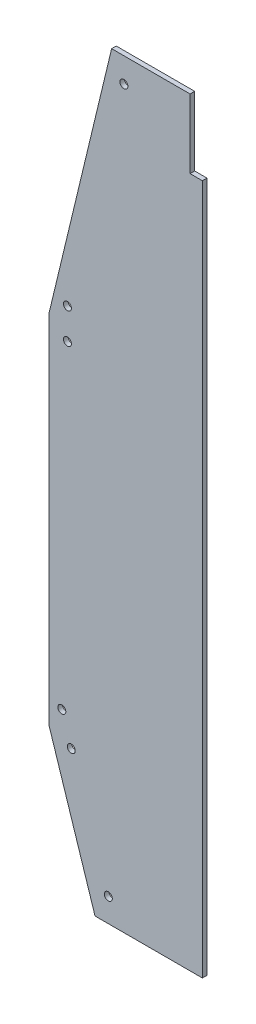
ISO-10303-21;
HEADER;
FILE_DESCRIPTION(('STEP AP214'),'2;1');
FILE_NAME('part.step','',(''),(''),'','','');
FILE_SCHEMA(('AUTOMOTIVE_DESIGN { 1 0 10303 214 1 1 1 1 }'));
ENDSEC;
DATA;
#1=APPLICATION_CONTEXT('core data for automotive mechanical design processes');
#2=APPLICATION_PROTOCOL_DEFINITION('international standard','automotive_design',2000,#1);
#3=PRODUCT_CONTEXT('',#1,'mechanical');
#4=PRODUCT('Part','Part','',(#3));
#5=PRODUCT_RELATED_PRODUCT_CATEGORY('part','',(#4));
#6=PRODUCT_DEFINITION_FORMATION('','',#4);
#7=PRODUCT_DEFINITION_CONTEXT('part definition',#1,'design');
#8=PRODUCT_DEFINITION('design','',#6,#7);
#9=PRODUCT_DEFINITION_SHAPE('','',#8);
#10=(LENGTH_UNIT() NAMED_UNIT(*) SI_UNIT(.MILLI.,.METRE.));
#11=(NAMED_UNIT(*) PLANE_ANGLE_UNIT() SI_UNIT($,.RADIAN.));
#12=(NAMED_UNIT(*) SI_UNIT($,.STERADIAN.) SOLID_ANGLE_UNIT());
#13=UNCERTAINTY_MEASURE_WITH_UNIT(LENGTH_MEASURE(1.E-05),#10,'distance_accuracy_value','');
#14=(GEOMETRIC_REPRESENTATION_CONTEXT(3) GLOBAL_UNCERTAINTY_ASSIGNED_CONTEXT((#13)) GLOBAL_UNIT_ASSIGNED_CONTEXT((#10,
#11,#12)) REPRESENTATION_CONTEXT('',''));
#15=CARTESIAN_POINT('',(0.,0.,0.));
#16=DIRECTION('',(0.,0.,1.));
#17=DIRECTION('',(1.,0.,0.));
#18=AXIS2_PLACEMENT_3D('',#15,#16,#17);
#19=CARTESIAN_POINT('',(0.,0.,3.));
#20=DIRECTION('',(-1.,0.,0.));
#21=DIRECTION('',(0.,-1.,0.));
#22=AXIS2_PLACEMENT_3D('',#19,#20,#21);
#23=PLANE('',#22);
#24=DIRECTION('',(0.,1.,0.));
#25=VECTOR('',#24,1.);
#26=CARTESIAN_POINT('',(0.,0.,0.));
#27=LINE('',#26,#25);
#28=CARTESIAN_POINT('',(0.,0.,0.));
#29=VERTEX_POINT('',#28);
#30=CARTESIAN_POINT('',(0.,450.3,0.));
#31=VERTEX_POINT('',#30);
#32=EDGE_CURVE('E133',#29,#31,#27,.T.);
#33=ORIENTED_EDGE('',*,*,#32,.T.);
#34=DIRECTION('',(0.,0.,-1.));
#35=VECTOR('',#34,1.);
#36=CARTESIAN_POINT('',(0.,450.3,3.));
#37=LINE('',#36,#35);
#38=CARTESIAN_POINT('',(0.,450.3,3.));
#39=VERTEX_POINT('',#38);
#40=EDGE_CURVE('E11',#39,#31,#37,.T.);
#41=ORIENTED_EDGE('',*,*,#40,.F.);
#42=DIRECTION('',(0.,1.,0.));
#43=VECTOR('',#42,1.);
#44=CARTESIAN_POINT('',(0.,0.,3.));
#45=LINE('',#44,#43);
#46=CARTESIAN_POINT('',(0.,0.,3.));
#47=VERTEX_POINT('',#46);
#48=EDGE_CURVE('E148',#47,#39,#45,.T.);
#49=ORIENTED_EDGE('',*,*,#48,.F.);
#50=DIRECTION('',(0.,0.,-1.));
#51=VECTOR('',#50,1.);
#52=CARTESIAN_POINT('',(0.,0.,3.));
#53=LINE('',#52,#51);
#54=EDGE_CURVE('E129',#47,#29,#53,.T.);
#55=ORIENTED_EDGE('',*,*,#54,.T.);
#56=EDGE_LOOP('',(#33,#41,#49,#55));
#57=FACE_BOUND('',#56,.T.);
#58=ADVANCED_FACE('F37',(#57),#23,.F.);
#59=CARTESIAN_POINT('',(0.,450.3,3.));
#60=DIRECTION('',(0.,-1.,0.));
#61=DIRECTION('',(1.,0.,0.));
#62=AXIS2_PLACEMENT_3D('',#59,#60,#61);
#63=PLANE('',#62);
#64=DIRECTION('',(-1.,0.,0.));
#65=VECTOR('',#64,1.);
#66=CARTESIAN_POINT('',(0.,450.3,0.));
#67=LINE('',#66,#65);
#68=CARTESIAN_POINT('',(-8.,450.3,0.));
#69=VERTEX_POINT('',#68);
#70=EDGE_CURVE('E136',#31,#69,#67,.T.);
#71=ORIENTED_EDGE('',*,*,#70,.T.);
#72=DIRECTION('',(0.,0.,-1.));
#73=VECTOR('',#72,1.);
#74=CARTESIAN_POINT('',(-8.,450.3,3.));
#75=LINE('',#74,#73);
#76=CARTESIAN_POINT('',(-8.,450.3,3.));
#77=VERTEX_POINT('',#76);
#78=EDGE_CURVE('E45',#77,#69,#75,.T.);
#79=ORIENTED_EDGE('',*,*,#78,.F.);
#80=DIRECTION('',(-1.,0.,0.));
#81=VECTOR('',#80,1.);
#82=CARTESIAN_POINT('',(0.,450.3,3.));
#83=LINE('',#82,#81);
#84=EDGE_CURVE('E96',#39,#77,#83,.T.);
#85=ORIENTED_EDGE('',*,*,#84,.F.);
#86=ORIENTED_EDGE('',*,*,#40,.T.);
#87=EDGE_LOOP('',(#71,#79,#85,#86));
#88=FACE_BOUND('',#87,.T.);
#89=ADVANCED_FACE('F245',(#88),#63,.F.);
#90=CARTESIAN_POINT('',(-8.,450.3,3.));
#91=DIRECTION('',(-1.,0.,0.));
#92=DIRECTION('',(0.,0.,1.));
#93=AXIS2_PLACEMENT_3D('',#90,#91,#92);
#94=PLANE('',#93);
#95=DIRECTION('',(0.,1.,0.));
#96=VECTOR('',#95,1.);
#97=CARTESIAN_POINT('',(-8.,450.3,0.));
#98=LINE('',#97,#96);
#99=CARTESIAN_POINT('',(-8.,495.3,0.));
#100=VERTEX_POINT('',#99);
#101=EDGE_CURVE('E139',#69,#100,#98,.T.);
#102=ORIENTED_EDGE('',*,*,#101,.T.);
#103=DIRECTION('',(0.,0.,-1.));
#104=VECTOR('',#103,1.);
#105=CARTESIAN_POINT('',(-8.,495.3,3.));
#106=LINE('',#105,#104);
#107=CARTESIAN_POINT('',(-8.,495.3,3.));
#108=VERTEX_POINT('',#107);
#109=EDGE_CURVE('E155',#108,#100,#106,.T.);
#110=ORIENTED_EDGE('',*,*,#109,.F.);
#111=DIRECTION('',(0.,1.,0.));
#112=VECTOR('',#111,1.);
#113=CARTESIAN_POINT('',(-8.,450.3,3.));
#114=LINE('',#113,#112);
#115=EDGE_CURVE('E163',#77,#108,#114,.T.);
#116=ORIENTED_EDGE('',*,*,#115,.F.);
#117=ORIENTED_EDGE('',*,*,#78,.T.);
#118=EDGE_LOOP('',(#102,#110,#116,#117));
#119=FACE_BOUND('',#118,.T.);
#120=ADVANCED_FACE('F161',(#119),#94,.F.);
#121=CARTESIAN_POINT('',(-8.,495.3,3.));
#122=DIRECTION('',(0.,-1.,0.));
#123=DIRECTION('',(0.,0.,-1.));
#124=AXIS2_PLACEMENT_3D('',#121,#122,#123);
#125=PLANE('',#124);
#126=DIRECTION('',(-1.,0.,0.));
#127=VECTOR('',#126,1.);
#128=CARTESIAN_POINT('',(-8.,495.3,0.));
#129=LINE('',#128,#127);
#130=CARTESIAN_POINT('',(-59.18,495.3,0.));
#131=VERTEX_POINT('',#130);
#132=EDGE_CURVE('E141',#100,#131,#129,.T.);
#133=ORIENTED_EDGE('',*,*,#132,.T.);
#134=DIRECTION('',(0.,0.,-1.));
#135=VECTOR('',#134,1.);
#136=CARTESIAN_POINT('',(-59.18,495.3,3.));
#137=LINE('',#136,#135);
#138=CARTESIAN_POINT('',(-59.18,495.3,3.));
#139=VERTEX_POINT('',#138);
#140=EDGE_CURVE('E152',#139,#131,#137,.T.);
#141=ORIENTED_EDGE('',*,*,#140,.F.);
#142=DIRECTION('',(-1.,0.,0.));
#143=VECTOR('',#142,1.);
#144=CARTESIAN_POINT('',(-8.,495.3,3.));
#145=LINE('',#144,#143);
#146=EDGE_CURVE('E175',#108,#139,#145,.T.);
#147=ORIENTED_EDGE('',*,*,#146,.F.);
#148=ORIENTED_EDGE('',*,*,#109,.T.);
#149=EDGE_LOOP('',(#133,#141,#147,#148));
#150=FACE_BOUND('',#149,.T.);
#151=ADVANCED_FACE('F171',(#150),#125,.F.);
#152=CARTESIAN_POINT('',(-59.18,495.3,3.));
#153=DIRECTION('',(0.972298871243199,-0.233741106738206,0.));
#154=DIRECTION('',(0.233741106738206,0.972298871243199,0.));
#155=AXIS2_PLACEMENT_3D('',#152,#153,#154);
#156=PLANE('',#155);
#157=DIRECTION('',(-0.233741106738206,-0.972298871243199,0.));
#158=VECTOR('',#157,1.);
#159=CARTESIAN_POINT('',(-59.18,495.3,0.));
#160=LINE('',#159,#158);
#161=CARTESIAN_POINT('',(-100.,325.5,0.));
#162=VERTEX_POINT('',#161);
#163=EDGE_CURVE('E143',#131,#162,#160,.T.);
#164=ORIENTED_EDGE('',*,*,#163,.T.);
#165=DIRECTION('',(0.,0.,-1.));
#166=VECTOR('',#165,1.);
#167=CARTESIAN_POINT('',(-100.,325.5,3.));
#168=LINE('',#167,#166);
#169=CARTESIAN_POINT('',(-100.,325.5,3.));
#170=VERTEX_POINT('',#169);
#171=EDGE_CURVE('E124',#170,#162,#168,.T.);
#172=ORIENTED_EDGE('',*,*,#171,.F.);
#173=DIRECTION('',(-0.233741106738206,-0.972298871243199,0.));
#174=VECTOR('',#173,1.);
#175=CARTESIAN_POINT('',(-59.18,495.3,3.));
#176=LINE('',#175,#174);
#177=EDGE_CURVE('E115',#139,#170,#176,.T.);
#178=ORIENTED_EDGE('',*,*,#177,.F.);
#179=ORIENTED_EDGE('',*,*,#140,.T.);
#180=EDGE_LOOP('',(#164,#172,#178,#179));
#181=FACE_BOUND('',#180,.T.);
#182=ADVANCED_FACE('F174',(#181),#156,.F.);
#183=CARTESIAN_POINT('',(-100.,92.65,3.));
#184=DIRECTION('',(1.,0.,0.));
#185=DIRECTION('',(0.,0.,-1.));
#186=AXIS2_PLACEMENT_3D('',#183,#184,#185);
#187=PLANE('',#186);
#188=DIRECTION('',(0.,-1.,0.));
#189=VECTOR('',#188,1.);
#190=CARTESIAN_POINT('',(-100.,92.65,0.));
#191=LINE('',#190,#189);
#192=CARTESIAN_POINT('',(-100.,92.65,0.));
#193=VERTEX_POINT('',#192);
#194=EDGE_CURVE('E123',#162,#193,#191,.T.);
#195=ORIENTED_EDGE('',*,*,#194,.T.);
#196=DIRECTION('',(0.,0.,-1.));
#197=VECTOR('',#196,1.);
#198=CARTESIAN_POINT('',(-100.,92.65,3.));
#199=LINE('',#198,#197);
#200=CARTESIAN_POINT('',(-100.,92.65,3.));
#201=VERTEX_POINT('',#200);
#202=EDGE_CURVE('E120',#201,#193,#199,.T.);
#203=ORIENTED_EDGE('',*,*,#202,.F.);
#204=DIRECTION('',(0.,-1.,0.));
#205=VECTOR('',#204,1.);
#206=CARTESIAN_POINT('',(-100.,92.65,3.));
#207=LINE('',#206,#205);
#208=EDGE_CURVE('E109',#170,#201,#207,.T.);
#209=ORIENTED_EDGE('',*,*,#208,.F.);
#210=ORIENTED_EDGE('',*,*,#171,.T.);
#211=EDGE_LOOP('',(#195,#203,#209,#210));
#212=FACE_BOUND('',#211,.T.);
#213=ADVANCED_FACE('F121',(#212),#187,.F.);
#214=CARTESIAN_POINT('',(-70.,0.,3.));
#215=DIRECTION('',(0.951369306348151,0.308052662605985,0.));
#216=DIRECTION('',(-0.308052662605985,0.951369306348152,0.));
#217=AXIS2_PLACEMENT_3D('',#214,#215,#216);
#218=PLANE('',#217);
#219=DIRECTION('',(0.308052662605985,-0.951369306348152,0.));
#220=VECTOR('',#219,1.);
#221=CARTESIAN_POINT('',(-70.,0.,0.));
#222=LINE('',#221,#220);
#223=CARTESIAN_POINT('',(-70.,0.,0.));
#224=VERTEX_POINT('',#223);
#225=EDGE_CURVE('E82',#193,#224,#222,.T.);
#226=ORIENTED_EDGE('',*,*,#225,.T.);
#227=DIRECTION('',(0.,0.,-1.));
#228=VECTOR('',#227,1.);
#229=CARTESIAN_POINT('',(-70.,0.,3.));
#230=LINE('',#229,#228);
#231=CARTESIAN_POINT('',(-70.,0.,3.));
#232=VERTEX_POINT('',#231);
#233=EDGE_CURVE('E125',#232,#224,#230,.T.);
#234=ORIENTED_EDGE('',*,*,#233,.F.);
#235=DIRECTION('',(0.308052662605985,-0.951369306348152,0.));
#236=VECTOR('',#235,1.);
#237=CARTESIAN_POINT('',(-70.,0.,3.));
#238=LINE('',#237,#236);
#239=EDGE_CURVE('E113',#201,#232,#238,.T.);
#240=ORIENTED_EDGE('',*,*,#239,.F.);
#241=ORIENTED_EDGE('',*,*,#202,.T.);
#242=EDGE_LOOP('',(#226,#234,#240,#241));
#243=FACE_BOUND('',#242,.T.);
#244=ADVANCED_FACE('F127',(#243),#218,.F.);
#245=CARTESIAN_POINT('',(0.,0.,3.));
#246=DIRECTION('',(0.,1.,0.));
#247=DIRECTION('',(-1.,0.,0.));
#248=AXIS2_PLACEMENT_3D('',#245,#246,#247);
#249=PLANE('',#248);
#250=DIRECTION('',(1.,0.,0.));
#251=VECTOR('',#250,1.);
#252=CARTESIAN_POINT('',(0.,0.,0.));
#253=LINE('',#252,#251);
#254=EDGE_CURVE('E88',#224,#29,#253,.T.);
#255=ORIENTED_EDGE('',*,*,#254,.T.);
#256=ORIENTED_EDGE('',*,*,#54,.F.);
#257=DIRECTION('',(1.,0.,0.));
#258=VECTOR('',#257,1.);
#259=CARTESIAN_POINT('',(0.,0.,3.));
#260=LINE('',#259,#258);
#261=EDGE_CURVE('E53',#232,#47,#260,.T.);
#262=ORIENTED_EDGE('',*,*,#261,.F.);
#263=ORIENTED_EDGE('',*,*,#233,.T.);
#264=EDGE_LOOP('',(#255,#256,#262,#263));
#265=FACE_BOUND('',#264,.T.);
#266=ADVANCED_FACE('F252',(#265),#249,.F.);
#267=CARTESIAN_POINT('',(0.,0.,3.));
#268=DIRECTION('',(0.,0.,1.));
#269=DIRECTION('',(1.,0.,0.));
#270=AXIS2_PLACEMENT_3D('',#267,#268,#269);
#271=PLANE('',#270);
#272=CARTESIAN_POINT('',(-61.3351873852428,15.4407470230038,3.));
#273=DIRECTION('',(0.,0.,1.));
#274=DIRECTION('',(1.,0.,0.));
#275=AXIS2_PLACEMENT_3D('',#272,#273,#274);
#276=CIRCLE('',#275,2.6);
#277=CARTESIAN_POINT('',(-58.7351873852428,15.4407470230038,3.));
#278=VERTEX_POINT('',#277);
#279=EDGE_CURVE('E137',#278,#278,#276,.T.);
#280=ORIENTED_EDGE('',*,*,#279,.F.);
#281=EDGE_LOOP('',(#280));
#282=FACE_BOUND('',#281,.T.);
#283=CARTESIAN_POINT('',(-85.5030416977623,86.8329388877904,3.));
#284=DIRECTION('',(0.,0.,1.));
#285=DIRECTION('',(1.,0.,0.));
#286=AXIS2_PLACEMENT_3D('',#283,#284,#285);
#287=CIRCLE('',#286,2.59999999999999);
#288=CARTESIAN_POINT('',(-82.9030416977623,86.8329388877904,3.));
#289=VERTEX_POINT('',#288);
#290=EDGE_CURVE('E183',#289,#289,#287,.T.);
#291=ORIENTED_EDGE('',*,*,#290,.F.);
#292=EDGE_LOOP('',(#291));
#293=FACE_BOUND('',#292,.T.);
#294=CARTESIAN_POINT('',(-91.664094949882,105.860325014753,3.));
#295=DIRECTION('',(0.,0.,1.));
#296=DIRECTION('',(1.,0.,0.));
#297=AXIS2_PLACEMENT_3D('',#294,#295,#296);
#298=CIRCLE('',#297,2.59999999999999);
#299=CARTESIAN_POINT('',(-89.064094949882,105.860325014753,3.));
#300=VERTEX_POINT('',#299);
#301=EDGE_CURVE('E186',#300,#300,#298,.T.);
#302=ORIENTED_EDGE('',*,*,#301,.F.);
#303=EDGE_LOOP('',(#302));
#304=FACE_BOUND('',#303,.T.);
#305=CARTESIAN_POINT('',(-88.,315.5,3.));
#306=DIRECTION('',(0.,0.,1.));
#307=DIRECTION('',(1.,0.,0.));
#308=AXIS2_PLACEMENT_3D('',#305,#306,#307);
#309=CIRCLE('',#308,2.6);
#310=CARTESIAN_POINT('',(-85.4,315.5,3.));
#311=VERTEX_POINT('',#310);
#312=EDGE_CURVE('E189',#311,#311,#309,.T.);
#313=ORIENTED_EDGE('',*,*,#312,.F.);
#314=EDGE_LOOP('',(#313));
#315=FACE_BOUND('',#314,.T.);
#316=CARTESIAN_POINT('',(-88.,335.5,3.));
#317=DIRECTION('',(0.,0.,1.));
#318=DIRECTION('',(1.,0.,0.));
#319=AXIS2_PLACEMENT_3D('',#316,#317,#318);
#320=CIRCLE('',#319,2.6);
#321=CARTESIAN_POINT('',(-85.4,335.5,3.));
#322=VERTEX_POINT('',#321);
#323=EDGE_CURVE('E192',#322,#322,#320,.T.);
#324=ORIENTED_EDGE('',*,*,#323,.F.);
#325=EDGE_LOOP('',(#324));
#326=FACE_BOUND('',#325,.T.);
#327=CARTESIAN_POINT('',(-51.1658068315665,479.3,3.));
#328=DIRECTION('',(0.,0.,1.));
#329=DIRECTION('',(1.,0.,0.));
#330=AXIS2_PLACEMENT_3D('',#327,#328,#329);
#331=CIRCLE('',#330,2.59999999999999);
#332=CARTESIAN_POINT('',(-48.5658068315666,479.3,3.));
#333=VERTEX_POINT('',#332);
#334=EDGE_CURVE('E195',#333,#333,#331,.T.);
#335=ORIENTED_EDGE('',*,*,#334,.F.);
#336=EDGE_LOOP('',(#335));
#337=FACE_BOUND('',#336,.T.);
#338=ORIENTED_EDGE('',*,*,#48,.T.);
#339=ORIENTED_EDGE('',*,*,#84,.T.);
#340=ORIENTED_EDGE('',*,*,#115,.T.);
#341=ORIENTED_EDGE('',*,*,#146,.T.);
#342=ORIENTED_EDGE('',*,*,#177,.T.);
#343=ORIENTED_EDGE('',*,*,#208,.T.);
#344=ORIENTED_EDGE('',*,*,#239,.T.);
#345=ORIENTED_EDGE('',*,*,#261,.T.);
#346=EDGE_LOOP('',(#338,#339,#340,#341,#342,#343,#344,#345));
#347=FACE_BOUND('',#346,.T.);
#348=ADVANCED_FACE('F111',(#282,#293,#304,#315,#326,#337,#347),#271,.T.);
#349=CARTESIAN_POINT('',(0.,0.,0.));
#350=DIRECTION('',(0.,0.,1.));
#351=DIRECTION('',(1.,0.,0.));
#352=AXIS2_PLACEMENT_3D('',#349,#350,#351);
#353=PLANE('',#352);
#354=CARTESIAN_POINT('',(-61.3351873852428,15.4407470230038,0.));
#355=DIRECTION('',(0.,0.,-1.));
#356=DIRECTION('',(-1.,0.,0.));
#357=AXIS2_PLACEMENT_3D('',#354,#355,#356);
#358=CIRCLE('',#357,2.6);
#359=CARTESIAN_POINT('',(-63.9351873852428,15.4407470230038,0.));
#360=VERTEX_POINT('',#359);
#361=EDGE_CURVE('E198',#360,#360,#358,.T.);
#362=ORIENTED_EDGE('',*,*,#361,.F.);
#363=EDGE_LOOP('',(#362));
#364=FACE_BOUND('',#363,.T.);
#365=CARTESIAN_POINT('',(-85.5030416977623,86.8329388877904,0.));
#366=DIRECTION('',(0.,0.,-1.));
#367=DIRECTION('',(-1.,0.,0.));
#368=AXIS2_PLACEMENT_3D('',#365,#366,#367);
#369=CIRCLE('',#368,2.59999999999999);
#370=CARTESIAN_POINT('',(-88.1030416977623,86.8329388877904,0.));
#371=VERTEX_POINT('',#370);
#372=EDGE_CURVE('E211',#371,#371,#369,.T.);
#373=ORIENTED_EDGE('',*,*,#372,.F.);
#374=EDGE_LOOP('',(#373));
#375=FACE_BOUND('',#374,.T.);
#376=CARTESIAN_POINT('',(-91.664094949882,105.860325014753,0.));
#377=DIRECTION('',(0.,0.,-1.));
#378=DIRECTION('',(-1.,0.,0.));
#379=AXIS2_PLACEMENT_3D('',#376,#377,#378);
#380=CIRCLE('',#379,2.59999999999999);
#381=CARTESIAN_POINT('',(-94.264094949882,105.860325014753,0.));
#382=VERTEX_POINT('',#381);
#383=EDGE_CURVE('E208',#382,#382,#380,.T.);
#384=ORIENTED_EDGE('',*,*,#383,.F.);
#385=EDGE_LOOP('',(#384));
#386=FACE_BOUND('',#385,.T.);
#387=CARTESIAN_POINT('',(-88.,315.5,0.));
#388=DIRECTION('',(0.,0.,-1.));
#389=DIRECTION('',(-1.,0.,0.));
#390=AXIS2_PLACEMENT_3D('',#387,#388,#389);
#391=CIRCLE('',#390,2.6);
#392=CARTESIAN_POINT('',(-90.6,315.5,0.));
#393=VERTEX_POINT('',#392);
#394=EDGE_CURVE('E205',#393,#393,#391,.T.);
#395=ORIENTED_EDGE('',*,*,#394,.F.);
#396=EDGE_LOOP('',(#395));
#397=FACE_BOUND('',#396,.T.);
#398=CARTESIAN_POINT('',(-88.,335.5,0.));
#399=DIRECTION('',(0.,0.,-1.));
#400=DIRECTION('',(-1.,0.,0.));
#401=AXIS2_PLACEMENT_3D('',#398,#399,#400);
#402=CIRCLE('',#401,2.6);
#403=CARTESIAN_POINT('',(-90.6,335.5,0.));
#404=VERTEX_POINT('',#403);
#405=EDGE_CURVE('E202',#404,#404,#402,.T.);
#406=ORIENTED_EDGE('',*,*,#405,.F.);
#407=EDGE_LOOP('',(#406));
#408=FACE_BOUND('',#407,.T.);
#409=CARTESIAN_POINT('',(-51.1658068315665,479.3,0.));
#410=DIRECTION('',(0.,0.,-1.));
#411=DIRECTION('',(-1.,0.,0.));
#412=AXIS2_PLACEMENT_3D('',#409,#410,#411);
#413=CIRCLE('',#412,2.59999999999999);
#414=CARTESIAN_POINT('',(-53.7658068315665,479.3,0.));
#415=VERTEX_POINT('',#414);
#416=EDGE_CURVE('E199',#415,#415,#413,.T.);
#417=ORIENTED_EDGE('',*,*,#416,.F.);
#418=EDGE_LOOP('',(#417));
#419=FACE_BOUND('',#418,.T.);
#420=ORIENTED_EDGE('',*,*,#32,.F.);
#421=ORIENTED_EDGE('',*,*,#254,.F.);
#422=ORIENTED_EDGE('',*,*,#225,.F.);
#423=ORIENTED_EDGE('',*,*,#194,.F.);
#424=ORIENTED_EDGE('',*,*,#163,.F.);
#425=ORIENTED_EDGE('',*,*,#132,.F.);
#426=ORIENTED_EDGE('',*,*,#101,.F.);
#427=ORIENTED_EDGE('',*,*,#70,.F.);
#428=EDGE_LOOP('',(#420,#421,#422,#423,#424,#425,#426,#427));
#429=FACE_BOUND('',#428,.T.);
#430=ADVANCED_FACE('F167',(#364,#375,#386,#397,#408,#419,#429),#353,.F.);
#431=CARTESIAN_POINT('',(-51.1658068315665,479.3,20.));
#432=DIRECTION('',(0.,0.,-1.));
#433=DIRECTION('',(-1.,0.,0.));
#434=AXIS2_PLACEMENT_3D('',#431,#432,#433);
#435=CYLINDRICAL_SURFACE('',#434,2.59999999999999);
#436=ORIENTED_EDGE('',*,*,#334,.T.);
#437=EDGE_LOOP('',(#436));
#438=FACE_BOUND('',#437,.T.);
#439=ORIENTED_EDGE('',*,*,#416,.T.);
#440=EDGE_LOOP('',(#439));
#441=FACE_BOUND('',#440,.T.);
#442=ADVANCED_FACE('F221',(#438,#441),#435,.F.);
#443=CARTESIAN_POINT('',(-88.,335.5,20.));
#444=DIRECTION('',(0.,0.,-1.));
#445=DIRECTION('',(-1.,0.,0.));
#446=AXIS2_PLACEMENT_3D('',#443,#444,#445);
#447=CYLINDRICAL_SURFACE('',#446,2.6);
#448=ORIENTED_EDGE('',*,*,#323,.T.);
#449=EDGE_LOOP('',(#448));
#450=FACE_BOUND('',#449,.T.);
#451=ORIENTED_EDGE('',*,*,#405,.T.);
#452=EDGE_LOOP('',(#451));
#453=FACE_BOUND('',#452,.T.);
#454=ADVANCED_FACE('F234',(#450,#453),#447,.F.);
#455=CARTESIAN_POINT('',(-88.,315.5,20.));
#456=DIRECTION('',(0.,0.,-1.));
#457=DIRECTION('',(-1.,0.,0.));
#458=AXIS2_PLACEMENT_3D('',#455,#456,#457);
#459=CYLINDRICAL_SURFACE('',#458,2.6);
#460=ORIENTED_EDGE('',*,*,#312,.T.);
#461=EDGE_LOOP('',(#460));
#462=FACE_BOUND('',#461,.T.);
#463=ORIENTED_EDGE('',*,*,#394,.T.);
#464=EDGE_LOOP('',(#463));
#465=FACE_BOUND('',#464,.T.);
#466=ADVANCED_FACE('F240',(#462,#465),#459,.F.);
#467=CARTESIAN_POINT('',(-91.664094949882,105.860325014753,20.));
#468=DIRECTION('',(0.,0.,-1.));
#469=DIRECTION('',(-1.,0.,0.));
#470=AXIS2_PLACEMENT_3D('',#467,#468,#469);
#471=CYLINDRICAL_SURFACE('',#470,2.59999999999999);
#472=ORIENTED_EDGE('',*,*,#301,.T.);
#473=EDGE_LOOP('',(#472));
#474=FACE_BOUND('',#473,.T.);
#475=ORIENTED_EDGE('',*,*,#383,.T.);
#476=EDGE_LOOP('',(#475));
#477=FACE_BOUND('',#476,.T.);
#478=ADVANCED_FACE('F324',(#474,#477),#471,.F.);
#479=CARTESIAN_POINT('',(-85.5030416977623,86.8329388877904,20.));
#480=DIRECTION('',(0.,0.,-1.));
#481=DIRECTION('',(-1.,0.,0.));
#482=AXIS2_PLACEMENT_3D('',#479,#480,#481);
#483=CYLINDRICAL_SURFACE('',#482,2.59999999999999);
#484=ORIENTED_EDGE('',*,*,#290,.T.);
#485=EDGE_LOOP('',(#484));
#486=FACE_BOUND('',#485,.T.);
#487=ORIENTED_EDGE('',*,*,#372,.T.);
#488=EDGE_LOOP('',(#487));
#489=FACE_BOUND('',#488,.T.);
#490=ADVANCED_FACE('F334',(#486,#489),#483,.F.);
#491=CARTESIAN_POINT('',(-61.3351873852428,15.4407470230038,20.));
#492=DIRECTION('',(0.,0.,-1.));
#493=DIRECTION('',(-1.,0.,0.));
#494=AXIS2_PLACEMENT_3D('',#491,#492,#493);
#495=CYLINDRICAL_SURFACE('',#494,2.6);
#496=ORIENTED_EDGE('',*,*,#279,.T.);
#497=EDGE_LOOP('',(#496));
#498=FACE_BOUND('',#497,.T.);
#499=ORIENTED_EDGE('',*,*,#361,.T.);
#500=EDGE_LOOP('',(#499));
#501=FACE_BOUND('',#500,.T.);
#502=ADVANCED_FACE('F217',(#498,#501),#495,.F.);
#503=CLOSED_SHELL('',(#58,#89,#120,#151,#182,#213,#244,#266,#348,#430,#442,#454,#466,#478,#490,#502));
#504=MANIFOLD_SOLID_BREP('B2',#503);
#505=ADVANCED_BREP_SHAPE_REPRESENTATION('',(#18,#504),#14);
#506=SHAPE_DEFINITION_REPRESENTATION(#9,#505);
ENDSEC;
END-ISO-10303-21;
